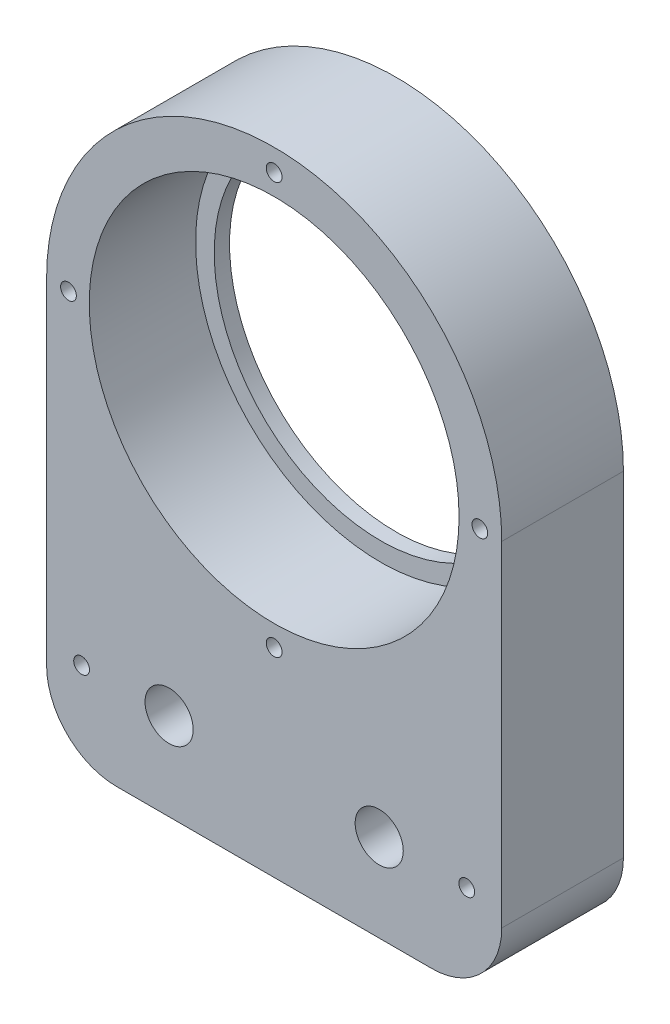
ISO-10303-21;
HEADER;
FILE_DESCRIPTION(('STEP AP214'),'2;1');
FILE_NAME('part.step','',(''),(''),'','','');
FILE_SCHEMA(('AUTOMOTIVE_DESIGN { 1 0 10303 214 1 1 1 1 }'));
ENDSEC;
DATA;
#1=APPLICATION_CONTEXT('core data for automotive mechanical design processes');
#2=APPLICATION_PROTOCOL_DEFINITION('international standard','automotive_design',2000,#1);
#3=PRODUCT_CONTEXT('',#1,'mechanical');
#4=PRODUCT('Part','Part','',(#3));
#5=PRODUCT_RELATED_PRODUCT_CATEGORY('part','',(#4));
#6=PRODUCT_DEFINITION_FORMATION('','',#4);
#7=PRODUCT_DEFINITION_CONTEXT('part definition',#1,'design');
#8=PRODUCT_DEFINITION('design','',#6,#7);
#9=PRODUCT_DEFINITION_SHAPE('','',#8);
#10=(LENGTH_UNIT() NAMED_UNIT(*) SI_UNIT(.MILLI.,.METRE.));
#11=(NAMED_UNIT(*) PLANE_ANGLE_UNIT() SI_UNIT($,.RADIAN.));
#12=(NAMED_UNIT(*) SI_UNIT($,.STERADIAN.) SOLID_ANGLE_UNIT());
#13=UNCERTAINTY_MEASURE_WITH_UNIT(LENGTH_MEASURE(1.E-05),#10,'distance_accuracy_value','');
#14=(GEOMETRIC_REPRESENTATION_CONTEXT(3) GLOBAL_UNCERTAINTY_ASSIGNED_CONTEXT((#13)) GLOBAL_UNIT_ASSIGNED_CONTEXT((#10,
#11,#12)) REPRESENTATION_CONTEXT('',''));
#15=CARTESIAN_POINT('',(0.,0.,0.));
#16=DIRECTION('',(0.,0.,1.));
#17=DIRECTION('',(1.,0.,0.));
#18=AXIS2_PLACEMENT_3D('',#15,#16,#17);
#19=CARTESIAN_POINT('',(12.,-10.,13.9));
#20=DIRECTION('',(0.,0.,-1.));
#21=DIRECTION('',(-1.,0.,0.));
#22=AXIS2_PLACEMENT_3D('',#19,#20,#21);
#23=CYLINDRICAL_SURFACE('',#22,2.75);
#24=CARTESIAN_POINT('',(12.,-10.,13.9));
#25=DIRECTION('',(0.,0.,1.));
#26=DIRECTION('',(1.,0.,0.));
#27=AXIS2_PLACEMENT_3D('',#24,#25,#26);
#28=CIRCLE('',#27,2.75);
#29=CARTESIAN_POINT('',(14.75,-10.,13.9));
#30=VERTEX_POINT('',#29);
#31=EDGE_CURVE('E192',#30,#30,#28,.T.);
#32=ORIENTED_EDGE('',*,*,#31,.T.);
#33=EDGE_LOOP('',(#32));
#34=FACE_BOUND('',#33,.T.);
#35=CARTESIAN_POINT('',(12.,-10.,3.));
#36=DIRECTION('',(0.,0.,-1.));
#37=DIRECTION('',(-1.,0.,0.));
#38=AXIS2_PLACEMENT_3D('',#35,#36,#37);
#39=CIRCLE('',#38,2.75);
#40=CARTESIAN_POINT('',(9.25000000000001,-10.,3.));
#41=VERTEX_POINT('',#40);
#42=EDGE_CURVE('E131',#41,#41,#39,.T.);
#43=ORIENTED_EDGE('',*,*,#42,.T.);
#44=EDGE_LOOP('',(#43));
#45=FACE_BOUND('',#44,.T.);
#46=ADVANCED_FACE('F41',(#34,#45),#23,.F.);
#47=CARTESIAN_POINT('',(-12.,-10.,13.9));
#48=DIRECTION('',(0.,0.,-1.));
#49=DIRECTION('',(-1.,0.,0.));
#50=AXIS2_PLACEMENT_3D('',#47,#48,#49);
#51=CYLINDRICAL_SURFACE('',#50,2.75);
#52=CARTESIAN_POINT('',(-12.,-10.,13.9));
#53=DIRECTION('',(0.,0.,1.));
#54=DIRECTION('',(1.,0.,0.));
#55=AXIS2_PLACEMENT_3D('',#52,#53,#54);
#56=CIRCLE('',#55,2.75);
#57=CARTESIAN_POINT('',(-9.25,-10.,13.9));
#58=VERTEX_POINT('',#57);
#59=EDGE_CURVE('E120',#58,#58,#56,.T.);
#60=ORIENTED_EDGE('',*,*,#59,.T.);
#61=EDGE_LOOP('',(#60));
#62=FACE_BOUND('',#61,.T.);
#63=CARTESIAN_POINT('',(-12.,-10.,3.));
#64=DIRECTION('',(0.,0.,-1.));
#65=DIRECTION('',(-1.,0.,0.));
#66=AXIS2_PLACEMENT_3D('',#63,#64,#65);
#67=CIRCLE('',#66,2.75);
#68=CARTESIAN_POINT('',(-14.75,-10.,3.));
#69=VERTEX_POINT('',#68);
#70=EDGE_CURVE('E128',#69,#69,#67,.T.);
#71=ORIENTED_EDGE('',*,*,#70,.T.);
#72=EDGE_LOOP('',(#71));
#73=FACE_BOUND('',#72,.T.);
#74=ADVANCED_FACE('F171',(#62,#73),#51,.F.);
#75=CARTESIAN_POINT('',(0.,26.25,13.9));
#76=DIRECTION('',(0.,0.,-1.));
#77=DIRECTION('',(-1.,0.,0.));
#78=AXIS2_PLACEMENT_3D('',#75,#76,#77);
#79=CYLINDRICAL_SURFACE('',#78,19.);
#80=CARTESIAN_POINT('',(0.,26.25,0.));
#81=DIRECTION('',(0.,0.,1.));
#82=DIRECTION('',(1.,0.,0.));
#83=AXIS2_PLACEMENT_3D('',#80,#81,#82);
#84=CIRCLE('',#83,19.);
#85=CARTESIAN_POINT('',(19.,26.25,0.));
#86=VERTEX_POINT('',#85);
#87=EDGE_CURVE('E110',#86,#86,#84,.T.);
#88=ORIENTED_EDGE('',*,*,#87,.F.);
#89=EDGE_LOOP('',(#88));
#90=FACE_BOUND('',#89,.T.);
#91=CARTESIAN_POINT('',(0.,26.25,1.75));
#92=DIRECTION('',(0.,0.,1.));
#93=DIRECTION('',(1.,0.,0.));
#94=AXIS2_PLACEMENT_3D('',#91,#92,#93);
#95=CIRCLE('',#94,19.);
#96=CARTESIAN_POINT('',(19.,26.25,1.75));
#97=VERTEX_POINT('',#96);
#98=EDGE_CURVE('E124',#97,#97,#95,.T.);
#99=ORIENTED_EDGE('',*,*,#98,.T.);
#100=EDGE_LOOP('',(#99));
#101=FACE_BOUND('',#100,.T.);
#102=ADVANCED_FACE('F168',(#90,#101),#79,.F.);
#103=CARTESIAN_POINT('',(0.,26.25,13.9));
#104=DIRECTION('',(0.,0.,-1.));
#105=DIRECTION('',(-1.,0.,0.));
#106=AXIS2_PLACEMENT_3D('',#103,#104,#105);
#107=CYLINDRICAL_SURFACE('',#106,26.);
#108=CARTESIAN_POINT('',(0.,26.25,0.));
#109=DIRECTION('',(0.,0.,1.));
#110=DIRECTION('',(1.,0.,0.));
#111=AXIS2_PLACEMENT_3D('',#108,#109,#110);
#112=CIRCLE('',#111,26.);
#113=CARTESIAN_POINT('',(26.,26.25,0.));
#114=VERTEX_POINT('',#113);
#115=CARTESIAN_POINT('',(-26.,26.25,0.));
#116=VERTEX_POINT('',#115);
#117=EDGE_CURVE('E114',#114,#116,#112,.T.);
#118=ORIENTED_EDGE('',*,*,#117,.T.);
#119=DIRECTION('',(0.,0.,-1.));
#120=VECTOR('',#119,1.);
#121=CARTESIAN_POINT('',(-26.,26.25,13.9));
#122=LINE('',#121,#120);
#123=CARTESIAN_POINT('',(-26.,26.25,13.9));
#124=VERTEX_POINT('',#123);
#125=EDGE_CURVE('E99',#124,#116,#122,.T.);
#126=ORIENTED_EDGE('',*,*,#125,.F.);
#127=CARTESIAN_POINT('',(0.,26.25,13.9));
#128=DIRECTION('',(0.,0.,1.));
#129=DIRECTION('',(1.,0.,0.));
#130=AXIS2_PLACEMENT_3D('',#127,#128,#129);
#131=CIRCLE('',#130,26.);
#132=CARTESIAN_POINT('',(26.,26.25,13.9));
#133=VERTEX_POINT('',#132);
#134=EDGE_CURVE('E103',#133,#124,#131,.T.);
#135=ORIENTED_EDGE('',*,*,#134,.F.);
#136=DIRECTION('',(0.,0.,-1.));
#137=VECTOR('',#136,1.);
#138=CARTESIAN_POINT('',(26.,26.25,13.9));
#139=LINE('',#138,#137);
#140=EDGE_CURVE('E116',#133,#114,#139,.T.);
#141=ORIENTED_EDGE('',*,*,#140,.T.);
#142=EDGE_LOOP('',(#118,#126,#135,#141));
#143=FACE_BOUND('',#142,.T.);
#144=ADVANCED_FACE('F112',(#143),#107,.T.);
#145=CARTESIAN_POINT('',(-26.,0.,13.9));
#146=DIRECTION('',(1.,0.,0.));
#147=DIRECTION('',(0.,1.,0.));
#148=AXIS2_PLACEMENT_3D('',#145,#146,#147);
#149=PLANE('',#148);
#150=DIRECTION('',(0.,-1.,0.));
#151=VECTOR('',#150,1.);
#152=CARTESIAN_POINT('',(-26.,0.,0.));
#153=LINE('',#152,#151);
#154=CARTESIAN_POINT('',(-26.,-12.,0.));
#155=VERTEX_POINT('',#154);
#156=EDGE_CURVE('E156',#116,#155,#153,.T.);
#157=ORIENTED_EDGE('',*,*,#156,.T.);
#158=DIRECTION('',(0.,0.,-1.));
#159=VECTOR('',#158,1.);
#160=CARTESIAN_POINT('',(-26.,-12.,13.9));
#161=LINE('',#160,#159);
#162=CARTESIAN_POINT('',(-26.,-12.,13.9));
#163=VERTEX_POINT('',#162);
#164=EDGE_CURVE('E64',#155,#163,#161,.F.);
#165=ORIENTED_EDGE('',*,*,#164,.T.);
#166=DIRECTION('',(0.,-1.,0.));
#167=VECTOR('',#166,1.);
#168=CARTESIAN_POINT('',(-26.,0.,13.9));
#169=LINE('',#168,#167);
#170=EDGE_CURVE('E95',#124,#163,#169,.T.);
#171=ORIENTED_EDGE('',*,*,#170,.F.);
#172=ORIENTED_EDGE('',*,*,#125,.T.);
#173=EDGE_LOOP('',(#157,#165,#171,#172));
#174=FACE_BOUND('',#173,.T.);
#175=ADVANCED_FACE('F97',(#174),#149,.F.);
#176=CARTESIAN_POINT('',(0.,-20.,13.9));
#177=DIRECTION('',(0.,1.,0.));
#178=DIRECTION('',(-1.,0.,0.));
#179=AXIS2_PLACEMENT_3D('',#176,#177,#178);
#180=PLANE('',#179);
#181=DIRECTION('',(1.,0.,0.));
#182=VECTOR('',#181,1.);
#183=CARTESIAN_POINT('',(0.,-20.,13.9));
#184=LINE('',#183,#182);
#185=CARTESIAN_POINT('',(-18.,-20.,13.9));
#186=VERTEX_POINT('',#185);
#187=CARTESIAN_POINT('',(18.,-20.,13.9));
#188=VERTEX_POINT('',#187);
#189=EDGE_CURVE('E102',#186,#188,#184,.T.);
#190=ORIENTED_EDGE('',*,*,#189,.F.);
#191=DIRECTION('',(0.,0.,-1.));
#192=VECTOR('',#191,1.);
#193=CARTESIAN_POINT('',(-18.,-20.,13.9));
#194=LINE('',#193,#192);
#195=CARTESIAN_POINT('',(-18.,-20.,0.));
#196=VERTEX_POINT('',#195);
#197=EDGE_CURVE('E118',#186,#196,#194,.T.);
#198=ORIENTED_EDGE('',*,*,#197,.T.);
#199=DIRECTION('',(1.,0.,0.));
#200=VECTOR('',#199,1.);
#201=CARTESIAN_POINT('',(0.,-20.,0.));
#202=LINE('',#201,#200);
#203=CARTESIAN_POINT('',(18.,-20.,0.));
#204=VERTEX_POINT('',#203);
#205=EDGE_CURVE('E157',#196,#204,#202,.T.);
#206=ORIENTED_EDGE('',*,*,#205,.T.);
#207=DIRECTION('',(0.,0.,-1.));
#208=VECTOR('',#207,1.);
#209=CARTESIAN_POINT('',(18.,-20.,13.9));
#210=LINE('',#209,#208);
#211=EDGE_CURVE('E115',#204,#188,#210,.F.);
#212=ORIENTED_EDGE('',*,*,#211,.T.);
#213=EDGE_LOOP('',(#190,#198,#206,#212));
#214=FACE_BOUND('',#213,.T.);
#215=ADVANCED_FACE('F147',(#214),#180,.F.);
#216=CARTESIAN_POINT('',(26.,0.,13.9));
#217=DIRECTION('',(1.,0.,0.));
#218=DIRECTION('',(0.,1.,0.));
#219=AXIS2_PLACEMENT_3D('',#216,#217,#218);
#220=PLANE('',#219);
#221=DIRECTION('',(0.,-1.,0.));
#222=VECTOR('',#221,1.);
#223=CARTESIAN_POINT('',(26.,0.,13.9));
#224=LINE('',#223,#222);
#225=CARTESIAN_POINT('',(26.,-12.,13.9));
#226=VERTEX_POINT('',#225);
#227=EDGE_CURVE('E108',#133,#226,#224,.T.);
#228=ORIENTED_EDGE('',*,*,#227,.T.);
#229=DIRECTION('',(0.,0.,-1.));
#230=VECTOR('',#229,1.);
#231=CARTESIAN_POINT('',(26.,-12.,0.));
#232=LINE('',#231,#230);
#233=CARTESIAN_POINT('',(26.,-12.,0.));
#234=VERTEX_POINT('',#233);
#235=EDGE_CURVE('E11',#226,#234,#232,.T.);
#236=ORIENTED_EDGE('',*,*,#235,.T.);
#237=DIRECTION('',(0.,-1.,0.));
#238=VECTOR('',#237,1.);
#239=CARTESIAN_POINT('',(26.,0.,0.));
#240=LINE('',#239,#238);
#241=EDGE_CURVE('E159',#114,#234,#240,.T.);
#242=ORIENTED_EDGE('',*,*,#241,.F.);
#243=ORIENTED_EDGE('',*,*,#140,.F.);
#244=EDGE_LOOP('',(#228,#236,#242,#243));
#245=FACE_BOUND('',#244,.T.);
#246=ADVANCED_FACE('F200',(#245),#220,.T.);
#247=CARTESIAN_POINT('',(0.,0.,13.9));
#248=DIRECTION('',(0.,0.,1.));
#249=DIRECTION('',(1.,0.,0.));
#250=AXIS2_PLACEMENT_3D('',#247,#248,#249);
#251=PLANE('',#250);
#252=CARTESIAN_POINT('',(0.,49.75,13.9));
#253=DIRECTION('',(0.,0.,1.));
#254=DIRECTION('',(1.,0.,0.));
#255=AXIS2_PLACEMENT_3D('',#252,#253,#254);
#256=CIRCLE('',#255,0.899999999999999);
#257=CARTESIAN_POINT('',(0.899999999999999,49.75,13.9));
#258=VERTEX_POINT('',#257);
#259=EDGE_CURVE('E393',#258,#258,#256,.T.);
#260=ORIENTED_EDGE('',*,*,#259,.F.);
#261=EDGE_LOOP('',(#260));
#262=FACE_BOUND('',#261,.T.);
#263=CARTESIAN_POINT('',(22.,-9.99999999999999,13.9));
#264=DIRECTION('',(0.,0.,1.));
#265=DIRECTION('',(-1.,0.,0.));
#266=AXIS2_PLACEMENT_3D('',#263,#264,#265);
#267=CIRCLE('',#266,0.9);
#268=CARTESIAN_POINT('',(21.1,-9.99999999999999,13.9));
#269=VERTEX_POINT('',#268);
#270=EDGE_CURVE('E405',#269,#269,#267,.T.);
#271=ORIENTED_EDGE('',*,*,#270,.F.);
#272=EDGE_LOOP('',(#271));
#273=FACE_BOUND('',#272,.T.);
#274=CARTESIAN_POINT('',(-23.5,26.25,13.9));
#275=DIRECTION('',(0.,0.,1.));
#276=DIRECTION('',(1.,0.,0.));
#277=AXIS2_PLACEMENT_3D('',#274,#275,#276);
#278=CIRCLE('',#277,0.899999999999509);
#279=CARTESIAN_POINT('',(-22.6000000000005,26.25,13.9));
#280=VERTEX_POINT('',#279);
#281=EDGE_CURVE('E398',#280,#280,#278,.T.);
#282=ORIENTED_EDGE('',*,*,#281,.F.);
#283=EDGE_LOOP('',(#282));
#284=FACE_BOUND('',#283,.T.);
#285=CARTESIAN_POINT('',(0.,2.75,13.9));
#286=DIRECTION('',(0.,0.,1.));
#287=DIRECTION('',(1.,0.,0.));
#288=AXIS2_PLACEMENT_3D('',#285,#286,#287);
#289=CIRCLE('',#288,0.89999999999921);
#290=CARTESIAN_POINT('',(0.899999999999204,2.75,13.9));
#291=VERTEX_POINT('',#290);
#292=EDGE_CURVE('E411',#291,#291,#289,.T.);
#293=ORIENTED_EDGE('',*,*,#292,.F.);
#294=EDGE_LOOP('',(#293));
#295=FACE_BOUND('',#294,.T.);
#296=CARTESIAN_POINT('',(23.5,26.25,13.9));
#297=DIRECTION('',(0.,0.,1.));
#298=DIRECTION('',(1.,0.,0.));
#299=AXIS2_PLACEMENT_3D('',#296,#297,#298);
#300=CIRCLE('',#299,0.899999999999548);
#301=CARTESIAN_POINT('',(24.3999999999995,26.25,13.9));
#302=VERTEX_POINT('',#301);
#303=EDGE_CURVE('E412',#302,#302,#300,.T.);
#304=ORIENTED_EDGE('',*,*,#303,.F.);
#305=EDGE_LOOP('',(#304));
#306=FACE_BOUND('',#305,.T.);
#307=CARTESIAN_POINT('',(-22.,-9.99999999999999,13.9));
#308=DIRECTION('',(0.,0.,1.));
#309=DIRECTION('',(1.,0.,0.));
#310=AXIS2_PLACEMENT_3D('',#307,#308,#309);
#311=CIRCLE('',#310,0.9);
#312=CARTESIAN_POINT('',(-21.1,-9.99999999999999,13.9));
#313=VERTEX_POINT('',#312);
#314=EDGE_CURVE('E404',#313,#313,#311,.T.);
#315=ORIENTED_EDGE('',*,*,#314,.F.);
#316=EDGE_LOOP('',(#315));
#317=FACE_BOUND('',#316,.T.);
#318=CARTESIAN_POINT('',(0.,26.25,13.9));
#319=DIRECTION('',(0.,0.,1.));
#320=DIRECTION('',(1.,0.,0.));
#321=AXIS2_PLACEMENT_3D('',#318,#319,#320);
#322=CIRCLE('',#321,21.125);
#323=CARTESIAN_POINT('',(21.125,26.25,13.9));
#324=VERTEX_POINT('',#323);
#325=EDGE_CURVE('E134',#324,#324,#322,.T.);
#326=ORIENTED_EDGE('',*,*,#325,.F.);
#327=EDGE_LOOP('',(#326));
#328=FACE_BOUND('',#327,.T.);
#329=ORIENTED_EDGE('',*,*,#170,.T.);
#330=CARTESIAN_POINT('',(-18.,-12.,13.9));
#331=DIRECTION('',(0.,0.,1.));
#332=DIRECTION('',(1.,0.,0.));
#333=AXIS2_PLACEMENT_3D('',#330,#331,#332);
#334=CIRCLE('',#333,8.);
#335=EDGE_CURVE('E49',#163,#186,#334,.T.);
#336=ORIENTED_EDGE('',*,*,#335,.T.);
#337=ORIENTED_EDGE('',*,*,#189,.T.);
#338=CARTESIAN_POINT('',(18.,-12.,13.9));
#339=DIRECTION('',(0.,0.,1.));
#340=DIRECTION('',(1.,0.,0.));
#341=AXIS2_PLACEMENT_3D('',#338,#339,#340);
#342=CIRCLE('',#341,8.);
#343=EDGE_CURVE('E56',#188,#226,#342,.T.);
#344=ORIENTED_EDGE('',*,*,#343,.T.);
#345=ORIENTED_EDGE('',*,*,#227,.F.);
#346=ORIENTED_EDGE('',*,*,#134,.T.);
#347=EDGE_LOOP('',(#329,#336,#337,#344,#345,#346));
#348=FACE_BOUND('',#347,.T.);
#349=ORIENTED_EDGE('',*,*,#31,.F.);
#350=EDGE_LOOP('',(#349));
#351=FACE_BOUND('',#350,.T.);
#352=ORIENTED_EDGE('',*,*,#59,.F.);
#353=EDGE_LOOP('',(#352));
#354=FACE_BOUND('',#353,.T.);
#355=ADVANCED_FACE('F106',(#262,#273,#284,#295,#306,#317,#328,#348,#351,#354),#251,.T.);
#356=CARTESIAN_POINT('',(0.,0.,0.));
#357=DIRECTION('',(0.,0.,1.));
#358=DIRECTION('',(1.,0.,0.));
#359=AXIS2_PLACEMENT_3D('',#356,#357,#358);
#360=PLANE('',#359);
#361=CARTESIAN_POINT('',(0.,49.75,0.));
#362=DIRECTION('',(0.,0.,1.));
#363=DIRECTION('',(1.,0.,0.));
#364=AXIS2_PLACEMENT_3D('',#361,#362,#363);
#365=CIRCLE('',#364,0.899999999999999);
#366=CARTESIAN_POINT('',(0.899999999999999,49.75,0.));
#367=VERTEX_POINT('',#366);
#368=EDGE_CURVE('E391',#367,#367,#365,.T.);
#369=ORIENTED_EDGE('',*,*,#368,.T.);
#370=EDGE_LOOP('',(#369));
#371=FACE_BOUND('',#370,.T.);
#372=CARTESIAN_POINT('',(22.,-9.99999999999999,0.));
#373=DIRECTION('',(0.,0.,1.));
#374=DIRECTION('',(-1.,0.,0.));
#375=AXIS2_PLACEMENT_3D('',#372,#373,#374);
#376=CIRCLE('',#375,0.9);
#377=CARTESIAN_POINT('',(21.1,-9.99999999999999,0.));
#378=VERTEX_POINT('',#377);
#379=EDGE_CURVE('E401',#378,#378,#376,.T.);
#380=ORIENTED_EDGE('',*,*,#379,.T.);
#381=EDGE_LOOP('',(#380));
#382=FACE_BOUND('',#381,.T.);
#383=CARTESIAN_POINT('',(-23.5,26.25,0.));
#384=DIRECTION('',(0.,0.,1.));
#385=DIRECTION('',(1.,0.,0.));
#386=AXIS2_PLACEMENT_3D('',#383,#384,#385);
#387=CIRCLE('',#386,0.899999999999509);
#388=CARTESIAN_POINT('',(-22.6000000000005,26.25,0.));
#389=VERTEX_POINT('',#388);
#390=EDGE_CURVE('E394',#389,#389,#387,.T.);
#391=ORIENTED_EDGE('',*,*,#390,.T.);
#392=EDGE_LOOP('',(#391));
#393=FACE_BOUND('',#392,.T.);
#394=CARTESIAN_POINT('',(0.,2.75,0.));
#395=DIRECTION('',(0.,0.,1.));
#396=DIRECTION('',(1.,0.,0.));
#397=AXIS2_PLACEMENT_3D('',#394,#395,#396);
#398=CIRCLE('',#397,0.89999999999921);
#399=CARTESIAN_POINT('',(0.899999999999204,2.75,0.));
#400=VERTEX_POINT('',#399);
#401=EDGE_CURVE('E422',#400,#400,#398,.T.);
#402=ORIENTED_EDGE('',*,*,#401,.T.);
#403=EDGE_LOOP('',(#402));
#404=FACE_BOUND('',#403,.T.);
#405=CARTESIAN_POINT('',(23.5,26.25,0.));
#406=DIRECTION('',(0.,0.,1.));
#407=DIRECTION('',(1.,0.,0.));
#408=AXIS2_PLACEMENT_3D('',#405,#406,#407);
#409=CIRCLE('',#408,0.899999999999548);
#410=CARTESIAN_POINT('',(24.3999999999995,26.25,0.));
#411=VERTEX_POINT('',#410);
#412=EDGE_CURVE('E408',#411,#411,#409,.T.);
#413=ORIENTED_EDGE('',*,*,#412,.T.);
#414=EDGE_LOOP('',(#413));
#415=FACE_BOUND('',#414,.T.);
#416=CARTESIAN_POINT('',(-22.,-9.99999999999999,0.));
#417=DIRECTION('',(0.,0.,1.));
#418=DIRECTION('',(1.,0.,0.));
#419=AXIS2_PLACEMENT_3D('',#416,#417,#418);
#420=CIRCLE('',#419,0.9);
#421=CARTESIAN_POINT('',(-21.1,-9.99999999999999,0.));
#422=VERTEX_POINT('',#421);
#423=EDGE_CURVE('E415',#422,#422,#420,.T.);
#424=ORIENTED_EDGE('',*,*,#423,.T.);
#425=EDGE_LOOP('',(#424));
#426=FACE_BOUND('',#425,.T.);
#427=CARTESIAN_POINT('',(12.,-10.,0.));
#428=DIRECTION('',(0.,0.,-1.));
#429=DIRECTION('',(-1.,0.,0.));
#430=AXIS2_PLACEMENT_3D('',#427,#428,#429);
#431=CIRCLE('',#430,5.);
#432=CARTESIAN_POINT('',(7.,-10.,0.));
#433=VERTEX_POINT('',#432);
#434=EDGE_CURVE('E429',#433,#433,#431,.T.);
#435=ORIENTED_EDGE('',*,*,#434,.F.);
#436=EDGE_LOOP('',(#435));
#437=FACE_BOUND('',#436,.T.);
#438=CARTESIAN_POINT('',(-12.,-10.,0.));
#439=DIRECTION('',(0.,0.,-1.));
#440=DIRECTION('',(-1.,0.,0.));
#441=AXIS2_PLACEMENT_3D('',#438,#439,#440);
#442=CIRCLE('',#441,5.);
#443=CARTESIAN_POINT('',(-17.,-10.,0.));
#444=VERTEX_POINT('',#443);
#445=EDGE_CURVE('E188',#444,#444,#442,.T.);
#446=ORIENTED_EDGE('',*,*,#445,.F.);
#447=EDGE_LOOP('',(#446));
#448=FACE_BOUND('',#447,.T.);
#449=ORIENTED_EDGE('',*,*,#205,.F.);
#450=CARTESIAN_POINT('',(-18.,-12.,0.));
#451=DIRECTION('',(0.,0.,1.));
#452=DIRECTION('',(1.,0.,0.));
#453=AXIS2_PLACEMENT_3D('',#450,#451,#452);
#454=CIRCLE('',#453,8.);
#455=EDGE_CURVE('E140',#196,#155,#454,.F.);
#456=ORIENTED_EDGE('',*,*,#455,.T.);
#457=ORIENTED_EDGE('',*,*,#156,.F.);
#458=ORIENTED_EDGE('',*,*,#117,.F.);
#459=ORIENTED_EDGE('',*,*,#241,.T.);
#460=CARTESIAN_POINT('',(18.,-12.,0.));
#461=DIRECTION('',(0.,0.,1.));
#462=DIRECTION('',(1.,0.,0.));
#463=AXIS2_PLACEMENT_3D('',#460,#461,#462);
#464=CIRCLE('',#463,8.);
#465=EDGE_CURVE('E138',#234,#204,#464,.F.);
#466=ORIENTED_EDGE('',*,*,#465,.T.);
#467=EDGE_LOOP('',(#449,#456,#457,#458,#459,#466));
#468=FACE_BOUND('',#467,.T.);
#469=ORIENTED_EDGE('',*,*,#87,.T.);
#470=EDGE_LOOP('',(#469));
#471=FACE_BOUND('',#470,.T.);
#472=ADVANCED_FACE('F154',(#371,#382,#393,#404,#415,#426,#437,#448,#468,#471),#360,.F.);
#473=CARTESIAN_POINT('',(0.,26.25,1.75));
#474=DIRECTION('',(0.,0.,1.));
#475=DIRECTION('',(1.,0.,0.));
#476=AXIS2_PLACEMENT_3D('',#473,#474,#475);
#477=CYLINDRICAL_SURFACE('',#476,21.125);
#478=CARTESIAN_POINT('',(0.,26.25,1.75));
#479=DIRECTION('',(0.,0.,1.));
#480=DIRECTION('',(1.,0.,0.));
#481=AXIS2_PLACEMENT_3D('',#478,#479,#480);
#482=CIRCLE('',#481,21.125);
#483=CARTESIAN_POINT('',(21.125,26.25,1.75));
#484=VERTEX_POINT('',#483);
#485=EDGE_CURVE('E127',#484,#484,#482,.T.);
#486=ORIENTED_EDGE('',*,*,#485,.F.);
#487=EDGE_LOOP('',(#486));
#488=FACE_BOUND('',#487,.T.);
#489=ORIENTED_EDGE('',*,*,#325,.T.);
#490=EDGE_LOOP('',(#489));
#491=FACE_BOUND('',#490,.T.);
#492=ADVANCED_FACE('F179',(#488,#491),#477,.F.);
#493=CARTESIAN_POINT('',(0.,26.25,1.75));
#494=DIRECTION('',(0.,0.,1.));
#495=DIRECTION('',(1.,0.,0.));
#496=AXIS2_PLACEMENT_3D('',#493,#494,#495);
#497=PLANE('',#496);
#498=ORIENTED_EDGE('',*,*,#98,.F.);
#499=EDGE_LOOP('',(#498));
#500=FACE_BOUND('',#499,.T.);
#501=ORIENTED_EDGE('',*,*,#485,.T.);
#502=EDGE_LOOP('',(#501));
#503=FACE_BOUND('',#502,.T.);
#504=ADVANCED_FACE('F175',(#500,#503),#497,.T.);
#505=CARTESIAN_POINT('',(-12.,-10.,3.));
#506=DIRECTION('',(0.,0.,-1.));
#507=DIRECTION('',(-1.,0.,0.));
#508=AXIS2_PLACEMENT_3D('',#505,#506,#507);
#509=CYLINDRICAL_SURFACE('',#508,5.);
#510=CARTESIAN_POINT('',(-12.,-10.,3.));
#511=DIRECTION('',(0.,0.,-1.));
#512=DIRECTION('',(-1.,0.,0.));
#513=AXIS2_PLACEMENT_3D('',#510,#511,#512);
#514=CIRCLE('',#513,5.);
#515=CARTESIAN_POINT('',(-17.,-10.,3.));
#516=VERTEX_POINT('',#515);
#517=EDGE_CURVE('E431',#516,#516,#514,.T.);
#518=ORIENTED_EDGE('',*,*,#517,.F.);
#519=EDGE_LOOP('',(#518));
#520=FACE_BOUND('',#519,.T.);
#521=ORIENTED_EDGE('',*,*,#445,.T.);
#522=EDGE_LOOP('',(#521));
#523=FACE_BOUND('',#522,.T.);
#524=ADVANCED_FACE('F178',(#520,#523),#509,.F.);
#525=CARTESIAN_POINT('',(-12.,-10.,3.));
#526=DIRECTION('',(0.,0.,-1.));
#527=DIRECTION('',(-1.,0.,0.));
#528=AXIS2_PLACEMENT_3D('',#525,#526,#527);
#529=PLANE('',#528);
#530=ORIENTED_EDGE('',*,*,#70,.F.);
#531=EDGE_LOOP('',(#530));
#532=FACE_BOUND('',#531,.T.);
#533=ORIENTED_EDGE('',*,*,#517,.T.);
#534=EDGE_LOOP('',(#533));
#535=FACE_BOUND('',#534,.T.);
#536=ADVANCED_FACE('F242',(#532,#535),#529,.T.);
#537=CARTESIAN_POINT('',(12.,-10.,3.));
#538=DIRECTION('',(0.,0.,-1.));
#539=DIRECTION('',(-1.,0.,0.));
#540=AXIS2_PLACEMENT_3D('',#537,#538,#539);
#541=CYLINDRICAL_SURFACE('',#540,5.);
#542=CARTESIAN_POINT('',(12.,-10.,3.));
#543=DIRECTION('',(0.,0.,-1.));
#544=DIRECTION('',(-1.,0.,0.));
#545=AXIS2_PLACEMENT_3D('',#542,#543,#544);
#546=CIRCLE('',#545,5.);
#547=CARTESIAN_POINT('',(7.,-10.,3.));
#548=VERTEX_POINT('',#547);
#549=EDGE_CURVE('E132',#548,#548,#546,.T.);
#550=ORIENTED_EDGE('',*,*,#549,.F.);
#551=EDGE_LOOP('',(#550));
#552=FACE_BOUND('',#551,.T.);
#553=ORIENTED_EDGE('',*,*,#434,.T.);
#554=EDGE_LOOP('',(#553));
#555=FACE_BOUND('',#554,.T.);
#556=ADVANCED_FACE('F236',(#552,#555),#541,.F.);
#557=CARTESIAN_POINT('',(12.,-10.,3.));
#558=DIRECTION('',(0.,0.,-1.));
#559=DIRECTION('',(-1.,0.,0.));
#560=AXIS2_PLACEMENT_3D('',#557,#558,#559);
#561=PLANE('',#560);
#562=ORIENTED_EDGE('',*,*,#42,.F.);
#563=EDGE_LOOP('',(#562));
#564=FACE_BOUND('',#563,.T.);
#565=ORIENTED_EDGE('',*,*,#549,.T.);
#566=EDGE_LOOP('',(#565));
#567=FACE_BOUND('',#566,.T.);
#568=ADVANCED_FACE('F229',(#564,#567),#561,.T.);
#569=CARTESIAN_POINT('',(-18.,-12.,13.9));
#570=DIRECTION('',(0.,0.,-1.));
#571=DIRECTION('',(-1.,0.,0.));
#572=AXIS2_PLACEMENT_3D('',#569,#570,#571);
#573=CYLINDRICAL_SURFACE('',#572,8.);
#574=ORIENTED_EDGE('',*,*,#335,.F.);
#575=ORIENTED_EDGE('',*,*,#164,.F.);
#576=ORIENTED_EDGE('',*,*,#455,.F.);
#577=ORIENTED_EDGE('',*,*,#197,.F.);
#578=EDGE_LOOP('',(#574,#575,#576,#577));
#579=FACE_BOUND('',#578,.T.);
#580=ADVANCED_FACE('F152',(#579),#573,.T.);
#581=CARTESIAN_POINT('',(18.,-12.,13.9));
#582=DIRECTION('',(0.,0.,1.));
#583=DIRECTION('',(1.,0.,0.));
#584=AXIS2_PLACEMENT_3D('',#581,#582,#583);
#585=CYLINDRICAL_SURFACE('',#584,8.);
#586=ORIENTED_EDGE('',*,*,#343,.F.);
#587=ORIENTED_EDGE('',*,*,#211,.F.);
#588=ORIENTED_EDGE('',*,*,#465,.F.);
#589=ORIENTED_EDGE('',*,*,#235,.F.);
#590=EDGE_LOOP('',(#586,#587,#588,#589));
#591=FACE_BOUND('',#590,.T.);
#592=ADVANCED_FACE('F43',(#591),#585,.T.);
#593=CARTESIAN_POINT('',(-22.,-9.99999999999999,0.));
#594=DIRECTION('',(0.,0.,1.));
#595=DIRECTION('',(1.,0.,0.));
#596=AXIS2_PLACEMENT_3D('',#593,#594,#595);
#597=CYLINDRICAL_SURFACE('',#596,0.9);
#598=ORIENTED_EDGE('',*,*,#423,.F.);
#599=EDGE_LOOP('',(#598));
#600=FACE_BOUND('',#599,.T.);
#601=ORIENTED_EDGE('',*,*,#314,.T.);
#602=EDGE_LOOP('',(#601));
#603=FACE_BOUND('',#602,.T.);
#604=ADVANCED_FACE('F234',(#600,#603),#597,.F.);
#605=CARTESIAN_POINT('',(23.5,26.25,0.));
#606=DIRECTION('',(0.,0.,1.));
#607=DIRECTION('',(1.,0.,0.));
#608=AXIS2_PLACEMENT_3D('',#605,#606,#607);
#609=CYLINDRICAL_SURFACE('',#608,0.899999999999548);
#610=ORIENTED_EDGE('',*,*,#412,.F.);
#611=EDGE_LOOP('',(#610));
#612=FACE_BOUND('',#611,.T.);
#613=ORIENTED_EDGE('',*,*,#303,.T.);
#614=EDGE_LOOP('',(#613));
#615=FACE_BOUND('',#614,.T.);
#616=ADVANCED_FACE('F337',(#612,#615),#609,.F.);
#617=CARTESIAN_POINT('',(0.,2.75,0.));
#618=DIRECTION('',(0.,0.,1.));
#619=DIRECTION('',(1.,0.,0.));
#620=AXIS2_PLACEMENT_3D('',#617,#618,#619);
#621=CYLINDRICAL_SURFACE('',#620,0.89999999999921);
#622=ORIENTED_EDGE('',*,*,#401,.F.);
#623=EDGE_LOOP('',(#622));
#624=FACE_BOUND('',#623,.T.);
#625=ORIENTED_EDGE('',*,*,#292,.T.);
#626=EDGE_LOOP('',(#625));
#627=FACE_BOUND('',#626,.T.);
#628=ADVANCED_FACE('F248',(#624,#627),#621,.F.);
#629=CARTESIAN_POINT('',(-23.5,26.25,0.));
#630=DIRECTION('',(0.,0.,1.));
#631=DIRECTION('',(1.,0.,0.));
#632=AXIS2_PLACEMENT_3D('',#629,#630,#631);
#633=CYLINDRICAL_SURFACE('',#632,0.899999999999509);
#634=ORIENTED_EDGE('',*,*,#390,.F.);
#635=EDGE_LOOP('',(#634));
#636=FACE_BOUND('',#635,.T.);
#637=ORIENTED_EDGE('',*,*,#281,.T.);
#638=EDGE_LOOP('',(#637));
#639=FACE_BOUND('',#638,.T.);
#640=ADVANCED_FACE('F356',(#636,#639),#633,.F.);
#641=CARTESIAN_POINT('',(22.,-9.99999999999999,0.));
#642=DIRECTION('',(0.,0.,1.));
#643=DIRECTION('',(1.,0.,0.));
#644=AXIS2_PLACEMENT_3D('',#641,#642,#643);
#645=CYLINDRICAL_SURFACE('',#644,0.9);
#646=ORIENTED_EDGE('',*,*,#379,.F.);
#647=EDGE_LOOP('',(#646));
#648=FACE_BOUND('',#647,.T.);
#649=ORIENTED_EDGE('',*,*,#270,.T.);
#650=EDGE_LOOP('',(#649));
#651=FACE_BOUND('',#650,.T.);
#652=ADVANCED_FACE('F365',(#648,#651),#645,.F.);
#653=CARTESIAN_POINT('',(0.,49.75,0.));
#654=DIRECTION('',(0.,0.,1.));
#655=DIRECTION('',(1.,0.,0.));
#656=AXIS2_PLACEMENT_3D('',#653,#654,#655);
#657=CYLINDRICAL_SURFACE('',#656,0.899999999999999);
#658=ORIENTED_EDGE('',*,*,#368,.F.);
#659=EDGE_LOOP('',(#658));
#660=FACE_BOUND('',#659,.T.);
#661=ORIENTED_EDGE('',*,*,#259,.T.);
#662=EDGE_LOOP('',(#661));
#663=FACE_BOUND('',#662,.T.);
#664=ADVANCED_FACE('F374',(#660,#663),#657,.F.);
#665=CLOSED_SHELL('',(#46,#74,#102,#144,#175,#215,#246,#355,#472,#492,#504,#524,#536,#556,#568,
#580,#592,#604,#616,#628,#640,#652,#664));
#666=MANIFOLD_SOLID_BREP('B2',#665);
#667=ADVANCED_BREP_SHAPE_REPRESENTATION('',(#18,#666),#14);
#668=SHAPE_DEFINITION_REPRESENTATION(#9,#667);
ENDSEC;
END-ISO-10303-21;
